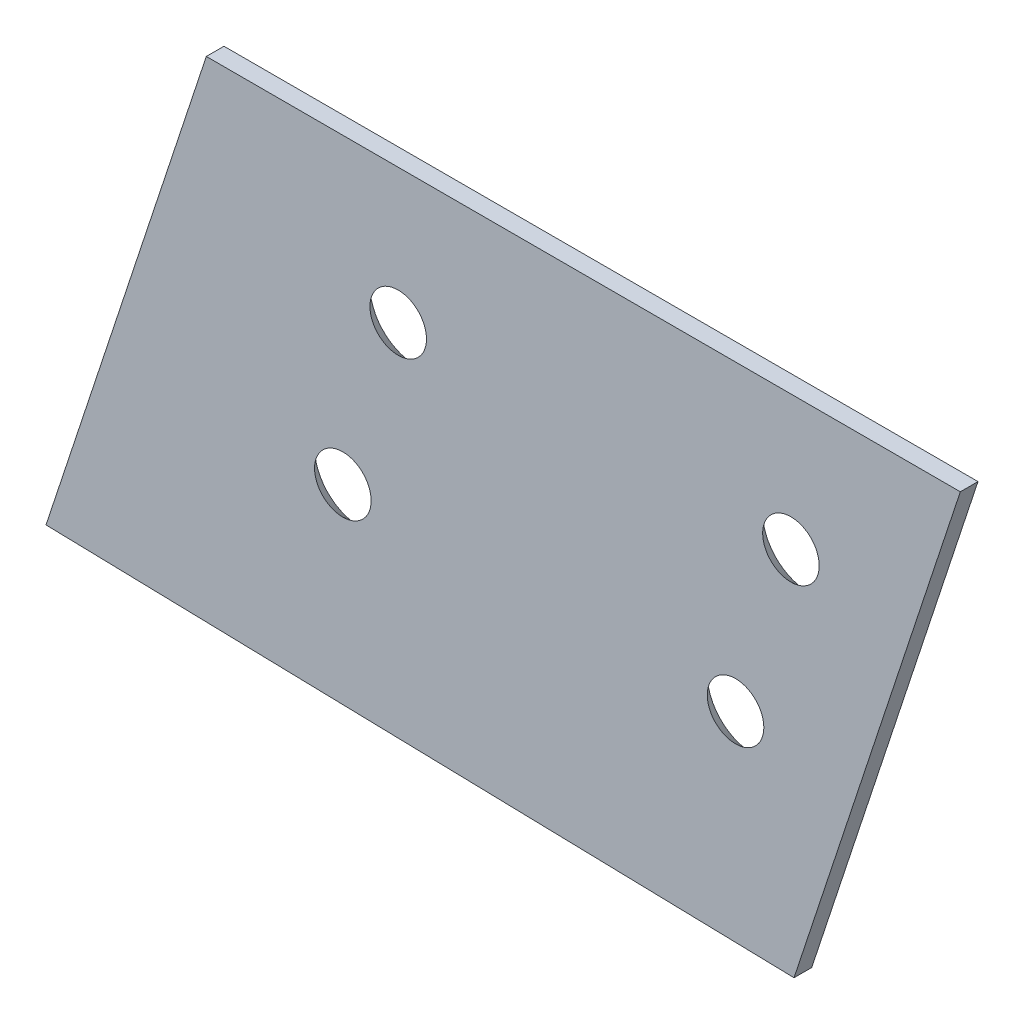
ISO-10303-21;
HEADER;
FILE_DESCRIPTION(('STEP AP214'),'2;1');
FILE_NAME('part.step','',(''),(''),'','','');
FILE_SCHEMA(('AUTOMOTIVE_DESIGN { 1 0 10303 214 1 1 1 1 }'));
ENDSEC;
DATA;
#1=APPLICATION_CONTEXT('core data for automotive mechanical design processes');
#2=APPLICATION_PROTOCOL_DEFINITION('international standard','automotive_design',2000,#1);
#3=PRODUCT_CONTEXT('',#1,'mechanical');
#4=PRODUCT('Part','Part','',(#3));
#5=PRODUCT_RELATED_PRODUCT_CATEGORY('part','',(#4));
#6=PRODUCT_DEFINITION_FORMATION('','',#4);
#7=PRODUCT_DEFINITION_CONTEXT('part definition',#1,'design');
#8=PRODUCT_DEFINITION('design','',#6,#7);
#9=PRODUCT_DEFINITION_SHAPE('','',#8);
#10=(LENGTH_UNIT() NAMED_UNIT(*) SI_UNIT(.MILLI.,.METRE.));
#11=(NAMED_UNIT(*) PLANE_ANGLE_UNIT() SI_UNIT($,.RADIAN.));
#12=(NAMED_UNIT(*) SI_UNIT($,.STERADIAN.) SOLID_ANGLE_UNIT());
#13=UNCERTAINTY_MEASURE_WITH_UNIT(LENGTH_MEASURE(1.E-05),#10,'distance_accuracy_value','');
#14=(GEOMETRIC_REPRESENTATION_CONTEXT(3) GLOBAL_UNCERTAINTY_ASSIGNED_CONTEXT((#13)) GLOBAL_UNIT_ASSIGNED_CONTEXT((#10,
#11,#12)) REPRESENTATION_CONTEXT('',''));
#15=CARTESIAN_POINT('',(0.,0.,0.));
#16=DIRECTION('',(0.,0.,1.));
#17=DIRECTION('',(1.,0.,0.));
#18=AXIS2_PLACEMENT_3D('',#15,#16,#17);
#19=CARTESIAN_POINT('',(0.,0.,2.));
#20=DIRECTION('',(0.,0.,1.));
#21=DIRECTION('',(1.,0.,0.));
#22=AXIS2_PLACEMENT_3D('',#19,#20,#21);
#23=PLANE('',#22);
#24=CARTESIAN_POINT('',(11.5493340812797,-39.8292302354657,2.));
#25=DIRECTION('',(0.,0.,1.));
#26=DIRECTION('',(1.,0.,0.));
#27=AXIS2_PLACEMENT_3D('',#24,#25,#26);
#28=CIRCLE('',#27,3.2);
#29=CARTESIAN_POINT('',(14.7493340812797,-39.8292302354657,2.));
#30=VERTEX_POINT('',#29);
#31=EDGE_CURVE('E40',#30,#30,#28,.T.);
#32=ORIENTED_EDGE('',*,*,#31,.F.);
#33=EDGE_LOOP('',(#32));
#34=FACE_BOUND('',#33,.T.);
#35=CARTESIAN_POINT('',(5.2827429716855,-58.8221193223097,2.));
#36=DIRECTION('',(0.,0.,1.));
#37=DIRECTION('',(1.,0.,0.));
#38=AXIS2_PLACEMENT_3D('',#35,#36,#37);
#39=CIRCLE('',#38,3.2);
#40=CARTESIAN_POINT('',(8.4827429716855,-58.8221193223097,2.));
#41=VERTEX_POINT('',#40);
#42=EDGE_CURVE('E98',#41,#41,#39,.T.);
#43=ORIENTED_EDGE('',*,*,#42,.F.);
#44=EDGE_LOOP('',(#43));
#45=FACE_BOUND('',#44,.T.);
#46=DIRECTION('',(-0.31332955547971,-0.949644454342196,0.));
#47=VECTOR('',#46,1.);
#48=CARTESIAN_POINT('',(-54.6191706498154,-24.5892302354657,2.));
#49=LINE('',#48,#47);
#50=CARTESIAN_POINT('',(-54.6191706498154,-24.5892302354657,2.));
#51=VERTEX_POINT('',#50);
#52=CARTESIAN_POINT('',(-72.7647118667564,-79.585039875331,2.));
#53=VERTEX_POINT('',#52);
#54=EDGE_CURVE('E84',#51,#53,#49,.T.);
#55=ORIENTED_EDGE('',*,*,#54,.T.);
#56=DIRECTION('',(0.999705738774359,-0.0242576969560779,0.));
#57=VECTOR('',#56,1.);
#58=CARTESIAN_POINT('',(-72.7647118667564,-79.585039875331,2.));
#59=LINE('',#58,#57);
#60=CARTESIAN_POINT('',(11.901447549833,-81.6394504462662,2.));
#61=VERTEX_POINT('',#60);
#62=EDGE_CURVE('E90',#53,#61,#59,.T.);
#63=ORIENTED_EDGE('',*,*,#62,.T.);
#64=DIRECTION('',(0.31332955547971,0.949644454342196,0.));
#65=VECTOR('',#64,1.);
#66=CARTESIAN_POINT('',(30.7248293501846,-24.5892302354657,2.));
#67=LINE('',#66,#65);
#68=CARTESIAN_POINT('',(30.7248293501846,-24.5892302354657,2.));
#69=VERTEX_POINT('',#68);
#70=EDGE_CURVE('E78',#61,#69,#67,.T.);
#71=ORIENTED_EDGE('',*,*,#70,.T.);
#72=DIRECTION('',(-1.,0.,0.));
#73=VECTOR('',#72,1.);
#74=CARTESIAN_POINT('',(-54.6191706498154,-24.5892302354657,2.));
#75=LINE('',#74,#73);
#76=EDGE_CURVE('E54',#69,#51,#75,.T.);
#77=ORIENTED_EDGE('',*,*,#76,.T.);
#78=EDGE_LOOP('',(#55,#63,#71,#77));
#79=FACE_BOUND('',#78,.T.);
#80=CARTESIAN_POINT('',(-39.1672570283145,-58.8221193223097,2.));
#81=DIRECTION('',(0.,0.,1.));
#82=DIRECTION('',(1.,0.,0.));
#83=AXIS2_PLACEMENT_3D('',#80,#81,#82);
#84=CIRCLE('',#83,3.2);
#85=CARTESIAN_POINT('',(-35.9672570283145,-58.8221193223097,2.));
#86=VERTEX_POINT('',#85);
#87=EDGE_CURVE('E170',#86,#86,#84,.T.);
#88=ORIENTED_EDGE('',*,*,#87,.F.);
#89=EDGE_LOOP('',(#88));
#90=FACE_BOUND('',#89,.T.);
#91=CARTESIAN_POINT('',(-32.9006659187203,-39.8292302354657,2.));
#92=DIRECTION('',(0.,0.,1.));
#93=DIRECTION('',(1.,0.,0.));
#94=AXIS2_PLACEMENT_3D('',#91,#92,#93);
#95=CIRCLE('',#94,3.2);
#96=CARTESIAN_POINT('',(-29.7006659187203,-39.8292302354657,2.));
#97=VERTEX_POINT('',#96);
#98=EDGE_CURVE('E164',#97,#97,#95,.T.);
#99=ORIENTED_EDGE('',*,*,#98,.F.);
#100=EDGE_LOOP('',(#99));
#101=FACE_BOUND('',#100,.T.);
#102=ADVANCED_FACE('F36',(#34,#45,#79,#90,#101),#23,.T.);
#103=CARTESIAN_POINT('',(0.,0.,0.));
#104=DIRECTION('',(0.,0.,1.));
#105=DIRECTION('',(1.,0.,0.));
#106=AXIS2_PLACEMENT_3D('',#103,#104,#105);
#107=PLANE('',#106);
#108=CARTESIAN_POINT('',(11.5493340812797,-39.8292302354657,0.));
#109=DIRECTION('',(0.,0.,-1.));
#110=DIRECTION('',(-1.,0.,0.));
#111=AXIS2_PLACEMENT_3D('',#108,#109,#110);
#112=CIRCLE('',#111,5.2);
#113=CARTESIAN_POINT('',(6.34933408127969,-39.8292302354657,0.));
#114=VERTEX_POINT('',#113);
#115=EDGE_CURVE('E158',#114,#114,#112,.T.);
#116=ORIENTED_EDGE('',*,*,#115,.F.);
#117=EDGE_LOOP('',(#116));
#118=FACE_BOUND('',#117,.T.);
#119=DIRECTION('',(-0.31332955547971,-0.949644454342196,0.));
#120=VECTOR('',#119,1.);
#121=CARTESIAN_POINT('',(-54.6191706498154,-24.5892302354657,0.));
#122=LINE('',#121,#120);
#123=CARTESIAN_POINT('',(-54.6191706498154,-24.5892302354657,0.));
#124=VERTEX_POINT('',#123);
#125=CARTESIAN_POINT('',(-72.7647118667564,-79.585039875331,0.));
#126=VERTEX_POINT('',#125);
#127=EDGE_CURVE('E92',#124,#126,#122,.T.);
#128=ORIENTED_EDGE('',*,*,#127,.F.);
#129=DIRECTION('',(-1.,0.,0.));
#130=VECTOR('',#129,1.);
#131=CARTESIAN_POINT('',(-54.6191706498154,-24.5892302354657,0.));
#132=LINE('',#131,#130);
#133=CARTESIAN_POINT('',(30.7248293501846,-24.5892302354657,0.));
#134=VERTEX_POINT('',#133);
#135=EDGE_CURVE('E106',#134,#124,#132,.T.);
#136=ORIENTED_EDGE('',*,*,#135,.F.);
#137=DIRECTION('',(0.31332955547971,0.949644454342196,0.));
#138=VECTOR('',#137,1.);
#139=CARTESIAN_POINT('',(30.7248293501846,-24.5892302354657,0.));
#140=LINE('',#139,#138);
#141=CARTESIAN_POINT('',(11.901447549833,-81.6394504462662,0.));
#142=VERTEX_POINT('',#141);
#143=EDGE_CURVE('E65',#142,#134,#140,.T.);
#144=ORIENTED_EDGE('',*,*,#143,.F.);
#145=DIRECTION('',(0.999705738774359,-0.0242576969560779,0.));
#146=VECTOR('',#145,1.);
#147=CARTESIAN_POINT('',(-72.7647118667564,-79.585039875331,0.));
#148=LINE('',#147,#146);
#149=EDGE_CURVE('E91',#126,#142,#148,.T.);
#150=ORIENTED_EDGE('',*,*,#149,.F.);
#151=EDGE_LOOP('',(#128,#136,#144,#150));
#152=FACE_BOUND('',#151,.T.);
#153=CARTESIAN_POINT('',(5.2827429716855,-58.8221193223097,0.));
#154=DIRECTION('',(0.,0.,-1.));
#155=DIRECTION('',(-1.,0.,0.));
#156=AXIS2_PLACEMENT_3D('',#153,#154,#155);
#157=CIRCLE('',#156,5.2);
#158=CARTESIAN_POINT('',(0.0827429716854997,-58.8221193223097,0.));
#159=VERTEX_POINT('',#158);
#160=EDGE_CURVE('E102',#159,#159,#157,.T.);
#161=ORIENTED_EDGE('',*,*,#160,.F.);
#162=EDGE_LOOP('',(#161));
#163=FACE_BOUND('',#162,.T.);
#164=CARTESIAN_POINT('',(-39.1672570283145,-58.8221193223097,0.));
#165=DIRECTION('',(0.,0.,-1.));
#166=DIRECTION('',(-1.,0.,0.));
#167=AXIS2_PLACEMENT_3D('',#164,#165,#166);
#168=CIRCLE('',#167,5.2);
#169=CARTESIAN_POINT('',(-44.3672570283145,-58.8221193223097,0.));
#170=VERTEX_POINT('',#169);
#171=EDGE_CURVE('E167',#170,#170,#168,.T.);
#172=ORIENTED_EDGE('',*,*,#171,.F.);
#173=EDGE_LOOP('',(#172));
#174=FACE_BOUND('',#173,.T.);
#175=CARTESIAN_POINT('',(-32.9006659187203,-39.8292302354657,0.));
#176=DIRECTION('',(0.,0.,-1.));
#177=DIRECTION('',(-1.,0.,0.));
#178=AXIS2_PLACEMENT_3D('',#175,#176,#177);
#179=CIRCLE('',#178,5.2);
#180=CARTESIAN_POINT('',(-38.1006659187203,-39.8292302354657,0.));
#181=VERTEX_POINT('',#180);
#182=EDGE_CURVE('E160',#181,#181,#179,.T.);
#183=ORIENTED_EDGE('',*,*,#182,.F.);
#184=EDGE_LOOP('',(#183));
#185=FACE_BOUND('',#184,.T.);
#186=ADVANCED_FACE('F116',(#118,#152,#163,#174,#185),#107,.F.);
#187=CARTESIAN_POINT('',(-54.6191706498154,-24.5892302354657,2.));
#188=DIRECTION('',(0.949644454342196,-0.31332955547971,0.));
#189=DIRECTION('',(0.31332955547971,0.949644454342196,0.));
#190=AXIS2_PLACEMENT_3D('',#187,#188,#189);
#191=PLANE('',#190);
#192=ORIENTED_EDGE('',*,*,#127,.T.);
#193=DIRECTION('',(0.,0.,1.));
#194=VECTOR('',#193,1.);
#195=CARTESIAN_POINT('',(-72.7647118667564,-79.585039875331,0.));
#196=LINE('',#195,#194);
#197=EDGE_CURVE('E93',#126,#53,#196,.T.);
#198=ORIENTED_EDGE('',*,*,#197,.T.);
#199=ORIENTED_EDGE('',*,*,#54,.F.);
#200=DIRECTION('',(0.,0.,-1.));
#201=VECTOR('',#200,1.);
#202=CARTESIAN_POINT('',(-54.6191706498154,-24.5892302354657,2.));
#203=LINE('',#202,#201);
#204=EDGE_CURVE('E46',#51,#124,#203,.T.);
#205=ORIENTED_EDGE('',*,*,#204,.T.);
#206=EDGE_LOOP('',(#192,#198,#199,#205));
#207=FACE_BOUND('',#206,.T.);
#208=ADVANCED_FACE('F38',(#207),#191,.F.);
#209=CARTESIAN_POINT('',(30.7248293501846,-24.5892302354657,2.));
#210=DIRECTION('',(-0.949644454342196,0.31332955547971,0.));
#211=DIRECTION('',(-0.31332955547971,-0.949644454342196,0.));
#212=AXIS2_PLACEMENT_3D('',#209,#210,#211);
#213=PLANE('',#212);
#214=ORIENTED_EDGE('',*,*,#143,.T.);
#215=DIRECTION('',(0.,0.,-1.));
#216=VECTOR('',#215,1.);
#217=CARTESIAN_POINT('',(30.7248293501846,-24.5892302354657,2.));
#218=LINE('',#217,#216);
#219=EDGE_CURVE('E11',#69,#134,#218,.T.);
#220=ORIENTED_EDGE('',*,*,#219,.F.);
#221=ORIENTED_EDGE('',*,*,#70,.F.);
#222=DIRECTION('',(0.,0.,1.));
#223=VECTOR('',#222,1.);
#224=CARTESIAN_POINT('',(11.901447549833,-81.6394504462662,0.));
#225=LINE('',#224,#223);
#226=EDGE_CURVE('E81',#142,#61,#225,.T.);
#227=ORIENTED_EDGE('',*,*,#226,.F.);
#228=EDGE_LOOP('',(#214,#220,#221,#227));
#229=FACE_BOUND('',#228,.T.);
#230=ADVANCED_FACE('F80',(#229),#213,.F.);
#231=CARTESIAN_POINT('',(-54.6191706498154,-24.5892302354657,2.));
#232=DIRECTION('',(0.,-1.,0.));
#233=DIRECTION('',(1.,0.,0.));
#234=AXIS2_PLACEMENT_3D('',#231,#232,#233);
#235=PLANE('',#234);
#236=ORIENTED_EDGE('',*,*,#135,.T.);
#237=ORIENTED_EDGE('',*,*,#204,.F.);
#238=ORIENTED_EDGE('',*,*,#76,.F.);
#239=ORIENTED_EDGE('',*,*,#219,.T.);
#240=EDGE_LOOP('',(#236,#237,#238,#239));
#241=FACE_BOUND('',#240,.T.);
#242=ADVANCED_FACE('F118',(#241),#235,.F.);
#243=CARTESIAN_POINT('',(-72.7647118667564,-79.585039875331,0.));
#244=DIRECTION('',(-0.0242576969560779,-0.999705738774359,0.));
#245=DIRECTION('',(0.999705738774359,-0.0242576969560779,0.));
#246=AXIS2_PLACEMENT_3D('',#243,#244,#245);
#247=PLANE('',#246);
#248=ORIENTED_EDGE('',*,*,#62,.F.);
#249=ORIENTED_EDGE('',*,*,#197,.F.);
#250=ORIENTED_EDGE('',*,*,#149,.T.);
#251=ORIENTED_EDGE('',*,*,#226,.T.);
#252=EDGE_LOOP('',(#248,#249,#250,#251));
#253=FACE_BOUND('',#252,.T.);
#254=ADVANCED_FACE('F88',(#253),#247,.T.);
#255=CARTESIAN_POINT('',(5.2827429716855,-58.8221193223097,0.));
#256=DIRECTION('',(0.,0.,-1.));
#257=DIRECTION('',(-1.,0.,0.));
#258=AXIS2_PLACEMENT_3D('',#255,#256,#257);
#259=CONICAL_SURFACE('',#258,5.2,0.785398163397448);
#260=ORIENTED_EDGE('',*,*,#42,.T.);
#261=EDGE_LOOP('',(#260));
#262=FACE_BOUND('',#261,.T.);
#263=ORIENTED_EDGE('',*,*,#160,.T.);
#264=EDGE_LOOP('',(#263));
#265=FACE_BOUND('',#264,.T.);
#266=ADVANCED_FACE('F125',(#262,#265),#259,.F.);
#267=CARTESIAN_POINT('',(-39.1672570283145,-58.8221193223097,0.));
#268=DIRECTION('',(0.,0.,-1.));
#269=DIRECTION('',(-1.,0.,0.));
#270=AXIS2_PLACEMENT_3D('',#267,#268,#269);
#271=CONICAL_SURFACE('',#270,5.2,0.785398163397448);
#272=ORIENTED_EDGE('',*,*,#87,.T.);
#273=EDGE_LOOP('',(#272));
#274=FACE_BOUND('',#273,.T.);
#275=ORIENTED_EDGE('',*,*,#171,.T.);
#276=EDGE_LOOP('',(#275));
#277=FACE_BOUND('',#276,.T.);
#278=ADVANCED_FACE('F140',(#274,#277),#271,.F.);
#279=CARTESIAN_POINT('',(-32.9006659187203,-39.8292302354657,0.));
#280=DIRECTION('',(0.,0.,-1.));
#281=DIRECTION('',(-1.,0.,0.));
#282=AXIS2_PLACEMENT_3D('',#279,#280,#281);
#283=CONICAL_SURFACE('',#282,5.2,0.785398163397448);
#284=ORIENTED_EDGE('',*,*,#98,.T.);
#285=EDGE_LOOP('',(#284));
#286=FACE_BOUND('',#285,.T.);
#287=ORIENTED_EDGE('',*,*,#182,.T.);
#288=EDGE_LOOP('',(#287));
#289=FACE_BOUND('',#288,.T.);
#290=ADVANCED_FACE('F144',(#286,#289),#283,.F.);
#291=CARTESIAN_POINT('',(11.5493340812797,-39.8292302354657,0.));
#292=DIRECTION('',(0.,0.,-1.));
#293=DIRECTION('',(-1.,0.,0.));
#294=AXIS2_PLACEMENT_3D('',#291,#292,#293);
#295=CONICAL_SURFACE('',#294,5.2,0.785398163397448);
#296=ORIENTED_EDGE('',*,*,#31,.T.);
#297=EDGE_LOOP('',(#296));
#298=FACE_BOUND('',#297,.T.);
#299=ORIENTED_EDGE('',*,*,#115,.T.);
#300=EDGE_LOOP('',(#299));
#301=FACE_BOUND('',#300,.T.);
#302=ADVANCED_FACE('F148',(#298,#301),#295,.F.);
#303=CLOSED_SHELL('',(#102,#186,#208,#230,#242,#254,#266,#278,#290,#302));
#304=MANIFOLD_SOLID_BREP('B2',#303);
#305=ADVANCED_BREP_SHAPE_REPRESENTATION('',(#18,#304),#14);
#306=SHAPE_DEFINITION_REPRESENTATION(#9,#305);
ENDSEC;
END-ISO-10303-21;
